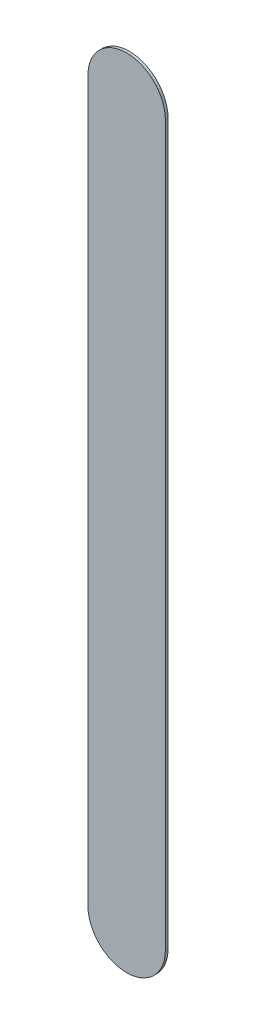
ISO-10303-21;
HEADER;
FILE_DESCRIPTION(('STEP AP214'),'2;1');
FILE_NAME('part.step','',(''),(''),'','','');
FILE_SCHEMA(('AUTOMOTIVE_DESIGN { 1 0 10303 214 1 1 1 1 }'));
ENDSEC;
DATA;
#1=APPLICATION_CONTEXT('core data for automotive mechanical design processes');
#2=APPLICATION_PROTOCOL_DEFINITION('international standard','automotive_design',2000,#1);
#3=PRODUCT_CONTEXT('',#1,'mechanical');
#4=PRODUCT('Part','Part','',(#3));
#5=PRODUCT_RELATED_PRODUCT_CATEGORY('part','',(#4));
#6=PRODUCT_DEFINITION_FORMATION('','',#4);
#7=PRODUCT_DEFINITION_CONTEXT('part definition',#1,'design');
#8=PRODUCT_DEFINITION('design','',#6,#7);
#9=PRODUCT_DEFINITION_SHAPE('','',#8);
#10=(LENGTH_UNIT() NAMED_UNIT(*) SI_UNIT(.MILLI.,.METRE.));
#11=(NAMED_UNIT(*) PLANE_ANGLE_UNIT() SI_UNIT($,.RADIAN.));
#12=(NAMED_UNIT(*) SI_UNIT($,.STERADIAN.) SOLID_ANGLE_UNIT());
#13=UNCERTAINTY_MEASURE_WITH_UNIT(LENGTH_MEASURE(1.E-05),#10,'distance_accuracy_value','');
#14=(GEOMETRIC_REPRESENTATION_CONTEXT(3) GLOBAL_UNCERTAINTY_ASSIGNED_CONTEXT((#13)) GLOBAL_UNIT_ASSIGNED_CONTEXT((#10,
#11,#12)) REPRESENTATION_CONTEXT('',''));
#15=CARTESIAN_POINT('',(0.,0.,0.));
#16=DIRECTION('',(0.,0.,1.));
#17=DIRECTION('',(1.,0.,0.));
#18=AXIS2_PLACEMENT_3D('',#15,#16,#17);
#19=CARTESIAN_POINT('',(118.39,-75.18,1.635));
#20=DIRECTION('',(0.,0.,1.));
#21=DIRECTION('',(1.,0.,0.));
#22=AXIS2_PLACEMENT_3D('',#19,#20,#21);
#23=PLANE('',#22);
#24=DIRECTION('',(0.,-1.,0.));
#25=VECTOR('',#24,1.);
#26=CARTESIAN_POINT('',(118.39,-75.18,1.635));
#27=LINE('',#26,#25);
#28=CARTESIAN_POINT('',(118.39,-75.18,1.635));
#29=VERTEX_POINT('',#28);
#30=CARTESIAN_POINT('',(118.39,-84.47,1.635));
#31=VERTEX_POINT('',#30);
#32=EDGE_CURVE('E100',#29,#31,#27,.T.);
#33=ORIENTED_EDGE('',*,*,#32,.T.);
#34=CARTESIAN_POINT('',(118.89,-84.47,1.635));
#35=DIRECTION('',(0.,0.,1.));
#36=DIRECTION('',(-1.,0.,0.));
#37=AXIS2_PLACEMENT_3D('',#34,#35,#36);
#38=CIRCLE('',#37,0.5);
#39=CARTESIAN_POINT('',(119.39,-84.47,1.635));
#40=VERTEX_POINT('',#39);
#41=EDGE_CURVE('E79',#31,#40,#38,.T.);
#42=ORIENTED_EDGE('',*,*,#41,.T.);
#43=DIRECTION('',(0.,1.,0.));
#44=VECTOR('',#43,1.);
#45=CARTESIAN_POINT('',(119.39,-84.47,1.635));
#46=LINE('',#45,#44);
#47=CARTESIAN_POINT('',(119.39,-75.18,1.635));
#48=VERTEX_POINT('',#47);
#49=EDGE_CURVE('E84',#40,#48,#46,.T.);
#50=ORIENTED_EDGE('',*,*,#49,.T.);
#51=CARTESIAN_POINT('',(118.89,-75.18,1.635));
#52=DIRECTION('',(0.,0.,1.));
#53=DIRECTION('',(1.,0.,0.));
#54=AXIS2_PLACEMENT_3D('',#51,#52,#53);
#55=CIRCLE('',#54,0.5);
#56=EDGE_CURVE('E11',#48,#29,#55,.T.);
#57=ORIENTED_EDGE('',*,*,#56,.T.);
#58=EDGE_LOOP('',(#33,#42,#50,#57));
#59=FACE_BOUND('',#58,.T.);
#60=ADVANCED_FACE('F17',(#59),#23,.T.);
#61=CARTESIAN_POINT('',(118.39,-75.18,1.6));
#62=DIRECTION('',(0.,0.,1.));
#63=DIRECTION('',(1.,0.,0.));
#64=AXIS2_PLACEMENT_3D('',#61,#62,#63);
#65=PLANE('',#64);
#66=CARTESIAN_POINT('',(118.89,-75.18,1.6));
#67=DIRECTION('',(0.,0.,1.));
#68=DIRECTION('',(1.,0.,0.));
#69=AXIS2_PLACEMENT_3D('',#66,#67,#68);
#70=CIRCLE('',#69,0.5);
#71=CARTESIAN_POINT('',(119.39,-75.18,1.6));
#72=VERTEX_POINT('',#71);
#73=CARTESIAN_POINT('',(118.39,-75.18,1.6));
#74=VERTEX_POINT('',#73);
#75=EDGE_CURVE('E20',#72,#74,#70,.T.);
#76=ORIENTED_EDGE('',*,*,#75,.F.);
#77=DIRECTION('',(0.,1.,0.));
#78=VECTOR('',#77,1.);
#79=CARTESIAN_POINT('',(119.39,-84.47,1.6));
#80=LINE('',#79,#78);
#81=CARTESIAN_POINT('',(119.39,-84.47,1.6));
#82=VERTEX_POINT('',#81);
#83=EDGE_CURVE('E67',#82,#72,#80,.T.);
#84=ORIENTED_EDGE('',*,*,#83,.F.);
#85=CARTESIAN_POINT('',(118.89,-84.47,1.6));
#86=DIRECTION('',(0.,0.,1.));
#87=DIRECTION('',(-1.,0.,0.));
#88=AXIS2_PLACEMENT_3D('',#85,#86,#87);
#89=CIRCLE('',#88,0.5);
#90=CARTESIAN_POINT('',(118.39,-84.47,1.6));
#91=VERTEX_POINT('',#90);
#92=EDGE_CURVE('E72',#91,#82,#89,.T.);
#93=ORIENTED_EDGE('',*,*,#92,.F.);
#94=DIRECTION('',(0.,-1.,0.));
#95=VECTOR('',#94,1.);
#96=CARTESIAN_POINT('',(118.39,-75.18,1.6));
#97=LINE('',#96,#95);
#98=EDGE_CURVE('E116',#74,#91,#97,.T.);
#99=ORIENTED_EDGE('',*,*,#98,.F.);
#100=EDGE_LOOP('',(#76,#84,#93,#99));
#101=FACE_BOUND('',#100,.T.);
#102=ADVANCED_FACE('F69',(#101),#65,.F.);
#103=CARTESIAN_POINT('',(118.89,-75.18,1.6));
#104=DIRECTION('',(0.,0.,-1.));
#105=DIRECTION('',(1.,0.,0.));
#106=AXIS2_PLACEMENT_3D('',#103,#104,#105);
#107=CYLINDRICAL_SURFACE('',#106,0.5);
#108=ORIENTED_EDGE('',*,*,#75,.T.);
#109=DIRECTION('',(0.,0.,1.));
#110=VECTOR('',#109,1.);
#111=CARTESIAN_POINT('',(118.39,-75.18,1.6));
#112=LINE('',#111,#110);
#113=EDGE_CURVE('E94',#74,#29,#112,.T.);
#114=ORIENTED_EDGE('',*,*,#113,.T.);
#115=ORIENTED_EDGE('',*,*,#56,.F.);
#116=DIRECTION('',(0.,0.,1.));
#117=VECTOR('',#116,1.);
#118=CARTESIAN_POINT('',(119.39,-75.18,1.6));
#119=LINE('',#118,#117);
#120=EDGE_CURVE('E78',#72,#48,#119,.T.);
#121=ORIENTED_EDGE('',*,*,#120,.F.);
#122=EDGE_LOOP('',(#108,#114,#115,#121));
#123=FACE_BOUND('',#122,.T.);
#124=ADVANCED_FACE('F112',(#123),#107,.T.);
#125=CARTESIAN_POINT('',(119.39,-84.47,1.6));
#126=DIRECTION('',(-1.,0.,0.));
#127=DIRECTION('',(0.,0.,1.));
#128=AXIS2_PLACEMENT_3D('',#125,#126,#127);
#129=PLANE('',#128);
#130=ORIENTED_EDGE('',*,*,#83,.T.);
#131=ORIENTED_EDGE('',*,*,#120,.T.);
#132=ORIENTED_EDGE('',*,*,#49,.F.);
#133=DIRECTION('',(0.,0.,1.));
#134=VECTOR('',#133,1.);
#135=CARTESIAN_POINT('',(119.39,-84.47,1.6));
#136=LINE('',#135,#134);
#137=EDGE_CURVE('E82',#82,#40,#136,.T.);
#138=ORIENTED_EDGE('',*,*,#137,.F.);
#139=EDGE_LOOP('',(#130,#131,#132,#138));
#140=FACE_BOUND('',#139,.T.);
#141=ADVANCED_FACE('F83',(#140),#129,.F.);
#142=CARTESIAN_POINT('',(118.89,-84.47,1.6));
#143=DIRECTION('',(0.,0.,-1.));
#144=DIRECTION('',(-1.,0.,0.));
#145=AXIS2_PLACEMENT_3D('',#142,#143,#144);
#146=CYLINDRICAL_SURFACE('',#145,0.5);
#147=ORIENTED_EDGE('',*,*,#92,.T.);
#148=ORIENTED_EDGE('',*,*,#137,.T.);
#149=ORIENTED_EDGE('',*,*,#41,.F.);
#150=DIRECTION('',(0.,0.,1.));
#151=VECTOR('',#150,1.);
#152=CARTESIAN_POINT('',(118.39,-84.47,1.6));
#153=LINE('',#152,#151);
#154=EDGE_CURVE('E91',#91,#31,#153,.T.);
#155=ORIENTED_EDGE('',*,*,#154,.F.);
#156=EDGE_LOOP('',(#147,#148,#149,#155));
#157=FACE_BOUND('',#156,.T.);
#158=ADVANCED_FACE('F89',(#157),#146,.T.);
#159=CARTESIAN_POINT('',(118.39,-75.18,1.6));
#160=DIRECTION('',(1.,0.,0.));
#161=DIRECTION('',(0.,1.,0.));
#162=AXIS2_PLACEMENT_3D('',#159,#160,#161);
#163=PLANE('',#162);
#164=ORIENTED_EDGE('',*,*,#98,.T.);
#165=ORIENTED_EDGE('',*,*,#154,.T.);
#166=ORIENTED_EDGE('',*,*,#32,.F.);
#167=ORIENTED_EDGE('',*,*,#113,.F.);
#168=EDGE_LOOP('',(#164,#165,#166,#167));
#169=FACE_BOUND('',#168,.T.);
#170=ADVANCED_FACE('F115',(#169),#163,.F.);
#171=CLOSED_SHELL('',(#60,#102,#124,#141,#158,#170));
#172=MANIFOLD_SOLID_BREP('B1',#171);
#173=ADVANCED_BREP_SHAPE_REPRESENTATION('',(#18,#172),#14);
#174=SHAPE_DEFINITION_REPRESENTATION(#9,#173);
ENDSEC;
END-ISO-10303-21;
